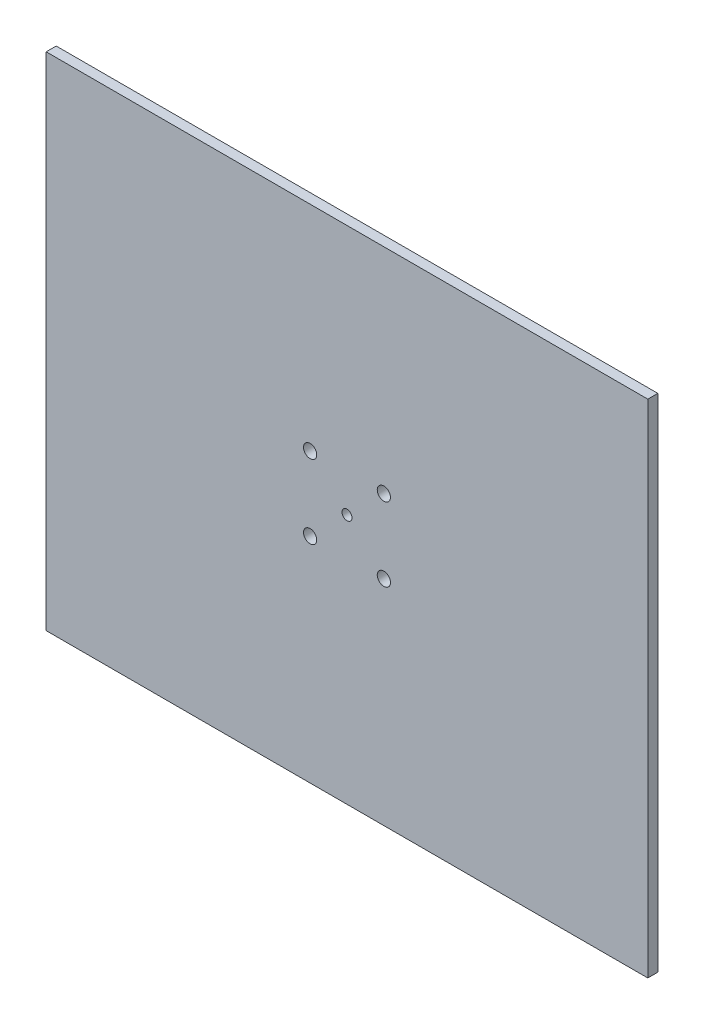
ISO-10303-21;
HEADER;
FILE_DESCRIPTION(('STEP AP214'),'2;1');
FILE_NAME('part.step','',(''),(''),'','','');
FILE_SCHEMA(('AUTOMOTIVE_DESIGN { 1 0 10303 214 1 1 1 1 }'));
ENDSEC;
DATA;
#1=APPLICATION_CONTEXT('core data for automotive mechanical design processes');
#2=APPLICATION_PROTOCOL_DEFINITION('international standard','automotive_design',2000,#1);
#3=PRODUCT_CONTEXT('',#1,'mechanical');
#4=PRODUCT('Part','Part','',(#3));
#5=PRODUCT_RELATED_PRODUCT_CATEGORY('part','',(#4));
#6=PRODUCT_DEFINITION_FORMATION('','',#4);
#7=PRODUCT_DEFINITION_CONTEXT('part definition',#1,'design');
#8=PRODUCT_DEFINITION('design','',#6,#7);
#9=PRODUCT_DEFINITION_SHAPE('','',#8);
#10=(LENGTH_UNIT() NAMED_UNIT(*) SI_UNIT(.MILLI.,.METRE.));
#11=(NAMED_UNIT(*) PLANE_ANGLE_UNIT() SI_UNIT($,.RADIAN.));
#12=(NAMED_UNIT(*) SI_UNIT($,.STERADIAN.) SOLID_ANGLE_UNIT());
#13=UNCERTAINTY_MEASURE_WITH_UNIT(LENGTH_MEASURE(1.E-05),#10,'distance_accuracy_value','');
#14=(GEOMETRIC_REPRESENTATION_CONTEXT(3) GLOBAL_UNCERTAINTY_ASSIGNED_CONTEXT((#13)) GLOBAL_UNIT_ASSIGNED_CONTEXT((#10,
#11,#12)) REPRESENTATION_CONTEXT('',''));
#15=CARTESIAN_POINT('',(0.,0.,0.));
#16=DIRECTION('',(0.,0.,1.));
#17=DIRECTION('',(1.,0.,0.));
#18=AXIS2_PLACEMENT_3D('',#15,#16,#17);
#19=CARTESIAN_POINT('',(0.,0.,5.));
#20=DIRECTION('',(0.,0.,1.));
#21=DIRECTION('',(1.,0.,0.));
#22=AXIS2_PLACEMENT_3D('',#19,#20,#21);
#23=PLANE('',#22);
#24=CARTESIAN_POINT('',(-18.3847763108501,-18.3847763108503,5.));
#25=DIRECTION('',(0.,0.,1.));
#26=DIRECTION('',(-1.,0.,0.));
#27=AXIS2_PLACEMENT_3D('',#24,#25,#26);
#28=CIRCLE('',#27,3.29999999999999);
#29=CARTESIAN_POINT('',(-21.6847763108501,-18.3847763108503,5.));
#30=VERTEX_POINT('',#29);
#31=EDGE_CURVE('E150',#30,#30,#28,.T.);
#32=ORIENTED_EDGE('',*,*,#31,.F.);
#33=EDGE_LOOP('',(#32));
#34=FACE_BOUND('',#33,.T.);
#35=CARTESIAN_POINT('',(18.38477631085,18.3847763108503,5.));
#36=DIRECTION('',(0.,0.,1.));
#37=DIRECTION('',(-1.,0.,0.));
#38=AXIS2_PLACEMENT_3D('',#35,#36,#37);
#39=CIRCLE('',#38,3.3);
#40=CARTESIAN_POINT('',(15.08477631085,18.3847763108503,5.));
#41=VERTEX_POINT('',#40);
#42=EDGE_CURVE('E134',#41,#41,#39,.T.);
#43=ORIENTED_EDGE('',*,*,#42,.F.);
#44=EDGE_LOOP('',(#43));
#45=FACE_BOUND('',#44,.T.);
#46=DIRECTION('',(0.,-1.,0.));
#47=VECTOR('',#46,1.);
#48=CARTESIAN_POINT('',(-150.,-125.,5.));
#49=LINE('',#48,#47);
#50=CARTESIAN_POINT('',(-150.,125.,5.));
#51=VERTEX_POINT('',#50);
#52=CARTESIAN_POINT('',(-150.,-125.,5.));
#53=VERTEX_POINT('',#52);
#54=EDGE_CURVE('E92',#51,#53,#49,.T.);
#55=ORIENTED_EDGE('',*,*,#54,.T.);
#56=DIRECTION('',(1.,0.,0.));
#57=VECTOR('',#56,1.);
#58=CARTESIAN_POINT('',(150.,-125.,5.));
#59=LINE('',#58,#57);
#60=CARTESIAN_POINT('',(150.,-125.,5.));
#61=VERTEX_POINT('',#60);
#62=EDGE_CURVE('E87',#53,#61,#59,.T.);
#63=ORIENTED_EDGE('',*,*,#62,.T.);
#64=DIRECTION('',(0.,1.,0.));
#65=VECTOR('',#64,1.);
#66=CARTESIAN_POINT('',(150.,-125.,5.));
#67=LINE('',#66,#65);
#68=CARTESIAN_POINT('',(150.,125.,5.));
#69=VERTEX_POINT('',#68);
#70=EDGE_CURVE('E90',#61,#69,#67,.T.);
#71=ORIENTED_EDGE('',*,*,#70,.T.);
#72=DIRECTION('',(-1.,0.,0.));
#73=VECTOR('',#72,1.);
#74=CARTESIAN_POINT('',(150.,125.,5.));
#75=LINE('',#74,#73);
#76=EDGE_CURVE('E57',#69,#51,#75,.T.);
#77=ORIENTED_EDGE('',*,*,#76,.T.);
#78=EDGE_LOOP('',(#55,#63,#71,#77));
#79=FACE_BOUND('',#78,.T.);
#80=CARTESIAN_POINT('',(-18.3847763108501,18.3847763108503,5.));
#81=DIRECTION('',(0.,0.,1.));
#82=DIRECTION('',(1.,0.,0.));
#83=AXIS2_PLACEMENT_3D('',#80,#81,#82);
#84=CIRCLE('',#83,3.3);
#85=CARTESIAN_POINT('',(-15.0847763108501,18.3847763108503,5.));
#86=VERTEX_POINT('',#85);
#87=EDGE_CURVE('E112',#86,#86,#84,.T.);
#88=ORIENTED_EDGE('',*,*,#87,.F.);
#89=EDGE_LOOP('',(#88));
#90=FACE_BOUND('',#89,.T.);
#91=CARTESIAN_POINT('',(18.38477631085,-18.3847763108503,5.));
#92=DIRECTION('',(0.,0.,1.));
#93=DIRECTION('',(1.,0.,0.));
#94=AXIS2_PLACEMENT_3D('',#91,#92,#93);
#95=CIRCLE('',#94,3.3);
#96=CARTESIAN_POINT('',(21.68477631085,-18.3847763108503,5.));
#97=VERTEX_POINT('',#96);
#98=EDGE_CURVE('E142',#97,#97,#95,.T.);
#99=ORIENTED_EDGE('',*,*,#98,.F.);
#100=EDGE_LOOP('',(#99));
#101=FACE_BOUND('',#100,.T.);
#102=CARTESIAN_POINT('',(0.,0.,5.));
#103=DIRECTION('',(0.,0.,1.));
#104=DIRECTION('',(1.,0.,0.));
#105=AXIS2_PLACEMENT_3D('',#102,#103,#104);
#106=CIRCLE('',#105,2.5);
#107=CARTESIAN_POINT('',(2.49999999999992,0.,5.));
#108=VERTEX_POINT('',#107);
#109=EDGE_CURVE('E158',#108,#108,#106,.T.);
#110=ORIENTED_EDGE('',*,*,#109,.F.);
#111=EDGE_LOOP('',(#110));
#112=FACE_BOUND('',#111,.T.);
#113=ADVANCED_FACE('F39',(#34,#45,#79,#90,#101,#112),#23,.T.);
#114=CARTESIAN_POINT('',(0.,0.,0.));
#115=DIRECTION('',(0.,0.,1.));
#116=DIRECTION('',(1.,0.,0.));
#117=AXIS2_PLACEMENT_3D('',#114,#115,#116);
#118=PLANE('',#117);
#119=DIRECTION('',(0.,-1.,0.));
#120=VECTOR('',#119,1.);
#121=CARTESIAN_POINT('',(-150.,-125.,0.));
#122=LINE('',#121,#120);
#123=CARTESIAN_POINT('',(-150.,125.,0.));
#124=VERTEX_POINT('',#123);
#125=CARTESIAN_POINT('',(-150.,-125.,0.));
#126=VERTEX_POINT('',#125);
#127=EDGE_CURVE('E108',#124,#126,#122,.T.);
#128=ORIENTED_EDGE('',*,*,#127,.F.);
#129=DIRECTION('',(-1.,0.,0.));
#130=VECTOR('',#129,1.);
#131=CARTESIAN_POINT('',(150.,125.,0.));
#132=LINE('',#131,#130);
#133=CARTESIAN_POINT('',(150.,125.,0.));
#134=VERTEX_POINT('',#133);
#135=EDGE_CURVE('E80',#134,#124,#132,.T.);
#136=ORIENTED_EDGE('',*,*,#135,.F.);
#137=DIRECTION('',(0.,1.,0.));
#138=VECTOR('',#137,1.);
#139=CARTESIAN_POINT('',(150.,-125.,0.));
#140=LINE('',#139,#138);
#141=CARTESIAN_POINT('',(150.,-125.,0.));
#142=VERTEX_POINT('',#141);
#143=EDGE_CURVE('E74',#142,#134,#140,.T.);
#144=ORIENTED_EDGE('',*,*,#143,.F.);
#145=DIRECTION('',(1.,0.,0.));
#146=VECTOR('',#145,1.);
#147=CARTESIAN_POINT('',(150.,-125.,0.));
#148=LINE('',#147,#146);
#149=EDGE_CURVE('E97',#126,#142,#148,.T.);
#150=ORIENTED_EDGE('',*,*,#149,.F.);
#151=EDGE_LOOP('',(#128,#136,#144,#150));
#152=FACE_BOUND('',#151,.T.);
#153=CARTESIAN_POINT('',(-18.3847763108501,18.3847763108503,0.));
#154=DIRECTION('',(0.,0.,1.));
#155=DIRECTION('',(1.,0.,0.));
#156=AXIS2_PLACEMENT_3D('',#153,#154,#155);
#157=CIRCLE('',#156,3.3);
#158=CARTESIAN_POINT('',(-15.0847763108501,18.3847763108503,0.));
#159=VERTEX_POINT('',#158);
#160=EDGE_CURVE('E130',#159,#159,#157,.T.);
#161=ORIENTED_EDGE('',*,*,#160,.T.);
#162=EDGE_LOOP('',(#161));
#163=FACE_BOUND('',#162,.T.);
#164=CARTESIAN_POINT('',(18.38477631085,18.3847763108503,0.));
#165=DIRECTION('',(0.,0.,1.));
#166=DIRECTION('',(-1.,0.,0.));
#167=AXIS2_PLACEMENT_3D('',#164,#165,#166);
#168=CIRCLE('',#167,3.3);
#169=CARTESIAN_POINT('',(15.08477631085,18.3847763108503,0.));
#170=VERTEX_POINT('',#169);
#171=EDGE_CURVE('E138',#170,#170,#168,.T.);
#172=ORIENTED_EDGE('',*,*,#171,.T.);
#173=EDGE_LOOP('',(#172));
#174=FACE_BOUND('',#173,.T.);
#175=CARTESIAN_POINT('',(18.38477631085,-18.3847763108503,0.));
#176=DIRECTION('',(0.,0.,1.));
#177=DIRECTION('',(1.,0.,0.));
#178=AXIS2_PLACEMENT_3D('',#175,#176,#177);
#179=CIRCLE('',#178,3.3);
#180=CARTESIAN_POINT('',(21.68477631085,-18.3847763108503,0.));
#181=VERTEX_POINT('',#180);
#182=EDGE_CURVE('E146',#181,#181,#179,.T.);
#183=ORIENTED_EDGE('',*,*,#182,.T.);
#184=EDGE_LOOP('',(#183));
#185=FACE_BOUND('',#184,.T.);
#186=CARTESIAN_POINT('',(-18.3847763108501,-18.3847763108503,0.));
#187=DIRECTION('',(0.,0.,1.));
#188=DIRECTION('',(-1.,0.,0.));
#189=AXIS2_PLACEMENT_3D('',#186,#187,#188);
#190=CIRCLE('',#189,3.29999999999999);
#191=CARTESIAN_POINT('',(-21.6847763108501,-18.3847763108503,0.));
#192=VERTEX_POINT('',#191);
#193=EDGE_CURVE('E154',#192,#192,#190,.T.);
#194=ORIENTED_EDGE('',*,*,#193,.T.);
#195=EDGE_LOOP('',(#194));
#196=FACE_BOUND('',#195,.T.);
#197=CARTESIAN_POINT('',(0.,0.,0.));
#198=DIRECTION('',(0.,0.,1.));
#199=DIRECTION('',(1.,0.,0.));
#200=AXIS2_PLACEMENT_3D('',#197,#198,#199);
#201=CIRCLE('',#200,2.5);
#202=CARTESIAN_POINT('',(2.49999999999992,0.,0.));
#203=VERTEX_POINT('',#202);
#204=EDGE_CURVE('E162',#203,#203,#201,.T.);
#205=ORIENTED_EDGE('',*,*,#204,.T.);
#206=EDGE_LOOP('',(#205));
#207=FACE_BOUND('',#206,.T.);
#208=ADVANCED_FACE('F125',(#152,#163,#174,#185,#196,#207),#118,.F.);
#209=CARTESIAN_POINT('',(-150.,-125.,5.));
#210=DIRECTION('',(1.,0.,0.));
#211=DIRECTION('',(0.,0.,-1.));
#212=AXIS2_PLACEMENT_3D('',#209,#210,#211);
#213=PLANE('',#212);
#214=ORIENTED_EDGE('',*,*,#127,.T.);
#215=DIRECTION('',(0.,0.,-1.));
#216=VECTOR('',#215,1.);
#217=CARTESIAN_POINT('',(-150.,-125.,5.));
#218=LINE('',#217,#216);
#219=EDGE_CURVE('E11',#53,#126,#218,.T.);
#220=ORIENTED_EDGE('',*,*,#219,.F.);
#221=ORIENTED_EDGE('',*,*,#54,.F.);
#222=DIRECTION('',(0.,0.,-1.));
#223=VECTOR('',#222,1.);
#224=CARTESIAN_POINT('',(-150.,125.,5.));
#225=LINE('',#224,#223);
#226=EDGE_CURVE('E104',#51,#124,#225,.T.);
#227=ORIENTED_EDGE('',*,*,#226,.T.);
#228=EDGE_LOOP('',(#214,#220,#221,#227));
#229=FACE_BOUND('',#228,.T.);
#230=ADVANCED_FACE('F41',(#229),#213,.F.);
#231=CARTESIAN_POINT('',(150.,-125.,5.));
#232=DIRECTION('',(0.,1.,0.));
#233=DIRECTION('',(-1.,0.,0.));
#234=AXIS2_PLACEMENT_3D('',#231,#232,#233);
#235=PLANE('',#234);
#236=ORIENTED_EDGE('',*,*,#149,.T.);
#237=DIRECTION('',(0.,0.,-1.));
#238=VECTOR('',#237,1.);
#239=CARTESIAN_POINT('',(150.,-125.,5.));
#240=LINE('',#239,#238);
#241=EDGE_CURVE('E49',#61,#142,#240,.T.);
#242=ORIENTED_EDGE('',*,*,#241,.F.);
#243=ORIENTED_EDGE('',*,*,#62,.F.);
#244=ORIENTED_EDGE('',*,*,#219,.T.);
#245=EDGE_LOOP('',(#236,#242,#243,#244));
#246=FACE_BOUND('',#245,.T.);
#247=ADVANCED_FACE('F96',(#246),#235,.F.);
#248=CARTESIAN_POINT('',(150.,-125.,5.));
#249=DIRECTION('',(-1.,0.,0.));
#250=DIRECTION('',(0.,-1.,0.));
#251=AXIS2_PLACEMENT_3D('',#248,#249,#250);
#252=PLANE('',#251);
#253=ORIENTED_EDGE('',*,*,#143,.T.);
#254=DIRECTION('',(0.,0.,-1.));
#255=VECTOR('',#254,1.);
#256=CARTESIAN_POINT('',(150.,125.,5.));
#257=LINE('',#256,#255);
#258=EDGE_CURVE('E99',#69,#134,#257,.T.);
#259=ORIENTED_EDGE('',*,*,#258,.F.);
#260=ORIENTED_EDGE('',*,*,#70,.F.);
#261=ORIENTED_EDGE('',*,*,#241,.T.);
#262=EDGE_LOOP('',(#253,#259,#260,#261));
#263=FACE_BOUND('',#262,.T.);
#264=ADVANCED_FACE('F100',(#263),#252,.F.);
#265=CARTESIAN_POINT('',(150.,125.,5.));
#266=DIRECTION('',(0.,-1.,0.));
#267=DIRECTION('',(1.,0.,0.));
#268=AXIS2_PLACEMENT_3D('',#265,#266,#267);
#269=PLANE('',#268);
#270=ORIENTED_EDGE('',*,*,#135,.T.);
#271=ORIENTED_EDGE('',*,*,#226,.F.);
#272=ORIENTED_EDGE('',*,*,#76,.F.);
#273=ORIENTED_EDGE('',*,*,#258,.T.);
#274=EDGE_LOOP('',(#270,#271,#272,#273));
#275=FACE_BOUND('',#274,.T.);
#276=ADVANCED_FACE('F122',(#275),#269,.F.);
#277=CARTESIAN_POINT('',(-18.3847763108501,18.3847763108503,5.));
#278=DIRECTION('',(0.,0.,-1.));
#279=DIRECTION('',(-1.,0.,0.));
#280=AXIS2_PLACEMENT_3D('',#277,#278,#279);
#281=CYLINDRICAL_SURFACE('',#280,3.3);
#282=ORIENTED_EDGE('',*,*,#87,.T.);
#283=EDGE_LOOP('',(#282));
#284=FACE_BOUND('',#283,.T.);
#285=ORIENTED_EDGE('',*,*,#160,.F.);
#286=EDGE_LOOP('',(#285));
#287=FACE_BOUND('',#286,.T.);
#288=ADVANCED_FACE('F183',(#284,#287),#281,.F.);
#289=CARTESIAN_POINT('',(18.38477631085,18.3847763108503,5.));
#290=DIRECTION('',(0.,0.,-1.));
#291=DIRECTION('',(-1.,0.,0.));
#292=AXIS2_PLACEMENT_3D('',#289,#290,#291);
#293=CYLINDRICAL_SURFACE('',#292,3.3);
#294=ORIENTED_EDGE('',*,*,#42,.T.);
#295=EDGE_LOOP('',(#294));
#296=FACE_BOUND('',#295,.T.);
#297=ORIENTED_EDGE('',*,*,#171,.F.);
#298=EDGE_LOOP('',(#297));
#299=FACE_BOUND('',#298,.T.);
#300=ADVANCED_FACE('F229',(#296,#299),#293,.F.);
#301=CARTESIAN_POINT('',(18.38477631085,-18.3847763108503,5.));
#302=DIRECTION('',(0.,0.,-1.));
#303=DIRECTION('',(-1.,0.,0.));
#304=AXIS2_PLACEMENT_3D('',#301,#302,#303);
#305=CYLINDRICAL_SURFACE('',#304,3.3);
#306=ORIENTED_EDGE('',*,*,#98,.T.);
#307=EDGE_LOOP('',(#306));
#308=FACE_BOUND('',#307,.T.);
#309=ORIENTED_EDGE('',*,*,#182,.F.);
#310=EDGE_LOOP('',(#309));
#311=FACE_BOUND('',#310,.T.);
#312=ADVANCED_FACE('F237',(#308,#311),#305,.F.);
#313=CARTESIAN_POINT('',(-18.3847763108501,-18.3847763108503,5.));
#314=DIRECTION('',(0.,0.,-1.));
#315=DIRECTION('',(-1.,0.,0.));
#316=AXIS2_PLACEMENT_3D('',#313,#314,#315);
#317=CYLINDRICAL_SURFACE('',#316,3.29999999999999);
#318=ORIENTED_EDGE('',*,*,#31,.T.);
#319=EDGE_LOOP('',(#318));
#320=FACE_BOUND('',#319,.T.);
#321=ORIENTED_EDGE('',*,*,#193,.F.);
#322=EDGE_LOOP('',(#321));
#323=FACE_BOUND('',#322,.T.);
#324=ADVANCED_FACE('F245',(#320,#323),#317,.F.);
#325=CARTESIAN_POINT('',(0.,0.,5.));
#326=DIRECTION('',(0.,0.,-1.));
#327=DIRECTION('',(-1.,0.,0.));
#328=AXIS2_PLACEMENT_3D('',#325,#326,#327);
#329=CYLINDRICAL_SURFACE('',#328,2.5);
#330=ORIENTED_EDGE('',*,*,#109,.T.);
#331=EDGE_LOOP('',(#330));
#332=FACE_BOUND('',#331,.T.);
#333=ORIENTED_EDGE('',*,*,#204,.F.);
#334=EDGE_LOOP('',(#333));
#335=FACE_BOUND('',#334,.T.);
#336=ADVANCED_FACE('F170',(#332,#335),#329,.F.);
#337=CLOSED_SHELL('',(#113,#208,#230,#247,#264,#276,#288,#300,#312,#324,#336));
#338=MANIFOLD_SOLID_BREP('B2',#337);
#339=ADVANCED_BREP_SHAPE_REPRESENTATION('',(#18,#338),#14);
#340=SHAPE_DEFINITION_REPRESENTATION(#9,#339);
ENDSEC;
END-ISO-10303-21;
